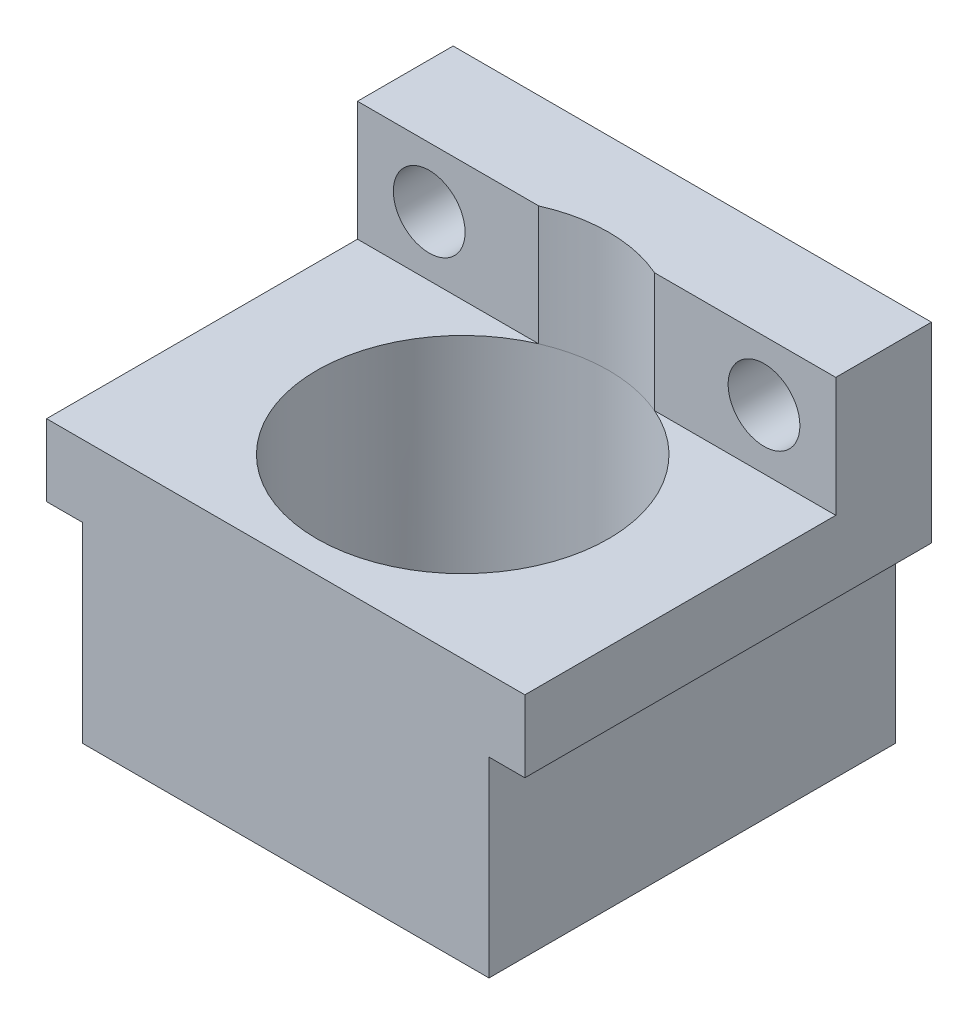
ISO-10303-21;
HEADER;
FILE_DESCRIPTION(('STEP AP214'),'2;1');
FILE_NAME('part.step','',(''),(''),'','','');
FILE_SCHEMA(('AUTOMOTIVE_DESIGN { 1 0 10303 214 1 1 1 1 }'));
ENDSEC;
DATA;
#1=APPLICATION_CONTEXT('core data for automotive mechanical design processes');
#2=APPLICATION_PROTOCOL_DEFINITION('international standard','automotive_design',2000,#1);
#3=PRODUCT_CONTEXT('',#1,'mechanical');
#4=PRODUCT('Part','Part','',(#3));
#5=PRODUCT_RELATED_PRODUCT_CATEGORY('part','',(#4));
#6=PRODUCT_DEFINITION_FORMATION('','',#4);
#7=PRODUCT_DEFINITION_CONTEXT('part definition',#1,'design');
#8=PRODUCT_DEFINITION('design','',#6,#7);
#9=PRODUCT_DEFINITION_SHAPE('','',#8);
#10=(LENGTH_UNIT() NAMED_UNIT(*) SI_UNIT(.MILLI.,.METRE.));
#11=(NAMED_UNIT(*) PLANE_ANGLE_UNIT() SI_UNIT($,.RADIAN.));
#12=(NAMED_UNIT(*) SI_UNIT($,.STERADIAN.) SOLID_ANGLE_UNIT());
#13=UNCERTAINTY_MEASURE_WITH_UNIT(LENGTH_MEASURE(1.E-05),#10,'distance_accuracy_value','');
#14=(GEOMETRIC_REPRESENTATION_CONTEXT(3) GLOBAL_UNCERTAINTY_ASSIGNED_CONTEXT((#13)) GLOBAL_UNIT_ASSIGNED_CONTEXT((#10,
#11,#12)) REPRESENTATION_CONTEXT('',''));
#15=CARTESIAN_POINT('',(0.,0.,0.));
#16=DIRECTION('',(0.,0.,1.));
#17=DIRECTION('',(1.,0.,0.));
#18=AXIS2_PLACEMENT_3D('',#15,#16,#17);
#19=CARTESIAN_POINT('',(-36.9079919345788,27.1123089983022,1.));
#20=DIRECTION('',(0.,0.,-1.));
#21=DIRECTION('',(-1.,0.,0.));
#22=AXIS2_PLACEMENT_3D('',#19,#20,#21);
#23=PLANE('',#22);
#24=CARTESIAN_POINT('',(-22.4079919345789,23.6123089983022,1.));
#25=DIRECTION('',(0.,0.,1.));
#26=DIRECTION('',(1.,0.,0.));
#27=AXIS2_PLACEMENT_3D('',#24,#25,#26);
#28=CIRCLE('',#27,1.5);
#29=CARTESIAN_POINT('',(-20.9079919345789,23.6123089983022,1.));
#30=VERTEX_POINT('',#29);
#31=EDGE_CURVE('E179',#30,#30,#28,.T.);
#32=ORIENTED_EDGE('',*,*,#31,.F.);
#33=EDGE_LOOP('',(#32));
#34=FACE_BOUND('',#33,.T.);
#35=DIRECTION('',(1.,0.,0.));
#36=VECTOR('',#35,1.);
#37=CARTESIAN_POINT('',(-19.4079919345789,26.1123089983022,1.));
#38=LINE('',#37,#36);
#39=CARTESIAN_POINT('',(-26.9870498805222,26.1123089983022,1.00000000000001));
#40=VERTEX_POINT('',#39);
#41=CARTESIAN_POINT('',(-19.4079919345789,26.1123089983022,1.));
#42=VERTEX_POINT('',#41);
#43=EDGE_CURVE('E166',#40,#42,#38,.T.);
#44=ORIENTED_EDGE('',*,*,#43,.F.);
#45=DIRECTION('',(0.,-1.,0.));
#46=VECTOR('',#45,1.);
#47=CARTESIAN_POINT('',(-26.9870498805222,26.1123089983022,1.00000000000001));
#48=LINE('',#47,#46);
#49=CARTESIAN_POINT('',(-26.9870498805222,21.1168375017223,1.00000000000001));
#50=VERTEX_POINT('',#49);
#51=EDGE_CURVE('E311',#40,#50,#48,.T.);
#52=ORIENTED_EDGE('',*,*,#51,.T.);
#53=DIRECTION('',(-1.,0.,0.));
#54=VECTOR('',#53,1.);
#55=CARTESIAN_POINT('',(-39.4079919345789,21.1168375017223,1.));
#56=LINE('',#55,#54);
#57=CARTESIAN_POINT('',(-19.4079919345789,21.1168375017223,1.));
#58=VERTEX_POINT('',#57);
#59=EDGE_CURVE('E190',#58,#50,#56,.T.);
#60=ORIENTED_EDGE('',*,*,#59,.F.);
#61=DIRECTION('',(0.,-1.,0.));
#62=VECTOR('',#61,1.);
#63=CARTESIAN_POINT('',(-19.4079919345789,26.1123089983022,1.));
#64=LINE('',#63,#62);
#65=EDGE_CURVE('E155',#42,#58,#64,.T.);
#66=ORIENTED_EDGE('',*,*,#65,.F.);
#67=EDGE_LOOP('',(#44,#52,#60,#66));
#68=FACE_BOUND('',#67,.T.);
#69=ADVANCED_FACE('F32',(#34,#68),#23,.F.);
#70=CARTESIAN_POINT('',(-36.4079919345789,23.6123089983022,1.));
#71=DIRECTION('',(0.,0.,1.));
#72=DIRECTION('',(1.,0.,0.));
#73=AXIS2_PLACEMENT_3D('',#70,#71,#72);
#74=CIRCLE('',#73,1.5);
#75=CARTESIAN_POINT('',(-34.9079919345789,23.6123089983022,1.));
#76=VERTEX_POINT('',#75);
#77=EDGE_CURVE('E173',#76,#76,#74,.T.);
#78=ORIENTED_EDGE('',*,*,#77,.F.);
#79=EDGE_LOOP('',(#78));
#80=FACE_BOUND('',#79,.T.);
#81=CARTESIAN_POINT('',(-31.8289339886355,21.1168375017223,1.00000000000001));
#82=VERTEX_POINT('',#81);
#83=CARTESIAN_POINT('',(-39.4079919345789,21.1168375017223,1.));
#84=VERTEX_POINT('',#83);
#85=EDGE_CURVE('E193',#82,#84,#56,.T.);
#86=ORIENTED_EDGE('',*,*,#85,.F.);
#87=DIRECTION('',(0.,-1.,0.));
#88=VECTOR('',#87,1.);
#89=CARTESIAN_POINT('',(-31.8289339886355,26.1123089983022,1.00000000000001));
#90=LINE('',#89,#88);
#91=CARTESIAN_POINT('',(-31.8289339886355,26.1123089983022,1.00000000000001));
#92=VERTEX_POINT('',#91);
#93=EDGE_CURVE('E262',#92,#82,#90,.T.);
#94=ORIENTED_EDGE('',*,*,#93,.F.);
#95=CARTESIAN_POINT('',(-39.4079919345789,26.1123089983022,1.));
#96=VERTEX_POINT('',#95);
#97=EDGE_CURVE('E159',#96,#92,#38,.T.);
#98=ORIENTED_EDGE('',*,*,#97,.F.);
#99=DIRECTION('',(0.,-1.,0.));
#100=VECTOR('',#99,1.);
#101=CARTESIAN_POINT('',(-39.4079919345789,26.1123089983022,1.));
#102=LINE('',#101,#100);
#103=EDGE_CURVE('E151',#96,#84,#102,.T.);
#104=ORIENTED_EDGE('',*,*,#103,.T.);
#105=EDGE_LOOP('',(#86,#94,#98,#104));
#106=FACE_BOUND('',#105,.T.);
#107=ADVANCED_FACE('F247',(#80,#106),#23,.F.);
#108=CARTESIAN_POINT('',(-54.9079919345788,10.1123089983022,17.));
#109=DIRECTION('',(0.,1.,0.));
#110=DIRECTION('',(0.,0.,1.));
#111=AXIS2_PLACEMENT_3D('',#108,#109,#110);
#112=PLANE('',#111);
#113=CARTESIAN_POINT('',(-29.4079919345789,10.1123089983022,6.59902130473711));
#114=DIRECTION('',(0.,1.,0.));
#115=DIRECTION('',(0.,0.,1.));
#116=AXIS2_PLACEMENT_3D('',#113,#114,#115);
#117=CIRCLE('',#116,4.5);
#118=CARTESIAN_POINT('',(-29.4079919345789,10.1123089983022,11.0990213047371));
#119=VERTEX_POINT('',#118);
#120=EDGE_CURVE('E297',#119,#119,#117,.T.);
#121=ORIENTED_EDGE('',*,*,#120,.T.);
#122=EDGE_LOOP('',(#121));
#123=FACE_BOUND('',#122,.T.);
#124=DIRECTION('',(-1.,0.,0.));
#125=VECTOR('',#124,1.);
#126=CARTESIAN_POINT('',(-2.90799193457886,10.1123089983022,-3.));
#127=LINE('',#126,#125);
#128=CARTESIAN_POINT('',(-20.9079919345789,10.1123089983022,-3.));
#129=VERTEX_POINT('',#128);
#130=CARTESIAN_POINT('',(-37.9079919345789,10.1123089983022,-3.));
#131=VERTEX_POINT('',#130);
#132=EDGE_CURVE('E41',#129,#131,#127,.T.);
#133=ORIENTED_EDGE('',*,*,#132,.F.);
#134=DIRECTION('',(0.,0.,1.));
#135=VECTOR('',#134,1.);
#136=CARTESIAN_POINT('',(-20.9079919345789,10.1123089983022,-3.));
#137=LINE('',#136,#135);
#138=CARTESIAN_POINT('',(-20.9079919345789,10.1123089983022,14.));
#139=VERTEX_POINT('',#138);
#140=EDGE_CURVE('E345',#129,#139,#137,.T.);
#141=ORIENTED_EDGE('',*,*,#140,.T.);
#142=DIRECTION('',(1.,0.,0.));
#143=VECTOR('',#142,1.);
#144=CARTESIAN_POINT('',(-19.4079919345789,10.1123089983022,14.));
#145=LINE('',#144,#143);
#146=CARTESIAN_POINT('',(-37.9079919345789,10.1123089983022,14.));
#147=VERTEX_POINT('',#146);
#148=EDGE_CURVE('E274',#147,#139,#145,.T.);
#149=ORIENTED_EDGE('',*,*,#148,.F.);
#150=DIRECTION('',(0.,0.,1.));
#151=VECTOR('',#150,1.);
#152=CARTESIAN_POINT('',(-37.9079919345789,10.1123089983022,-3.));
#153=LINE('',#152,#151);
#154=EDGE_CURVE('E56',#131,#147,#153,.T.);
#155=ORIENTED_EDGE('',*,*,#154,.F.);
#156=EDGE_LOOP('',(#133,#141,#149,#155));
#157=FACE_BOUND('',#156,.T.);
#158=ADVANCED_FACE('F34',(#123,#157),#112,.F.);
#159=CARTESIAN_POINT('',(0.,0.,-3.));
#160=DIRECTION('',(0.,0.,-1.));
#161=DIRECTION('',(-1.,0.,0.));
#162=AXIS2_PLACEMENT_3D('',#159,#160,#161);
#163=PLANE('',#162);
#164=DIRECTION('',(0.,-1.,0.));
#165=VECTOR('',#164,1.);
#166=CARTESIAN_POINT('',(-20.9079919345789,10.1123089983022,-3.));
#167=LINE('',#166,#165);
#168=CARTESIAN_POINT('',(-20.9079919345789,18.1123089983022,-3.));
#169=VERTEX_POINT('',#168);
#170=EDGE_CURVE('E130',#169,#129,#167,.T.);
#171=ORIENTED_EDGE('',*,*,#170,.T.);
#172=ORIENTED_EDGE('',*,*,#132,.T.);
#173=DIRECTION('',(0.,1.,0.));
#174=VECTOR('',#173,1.);
#175=CARTESIAN_POINT('',(-37.9079919345789,10.1123089983022,-3.));
#176=LINE('',#175,#174);
#177=CARTESIAN_POINT('',(-37.9079919345789,18.1123089983022,-3.));
#178=VERTEX_POINT('',#177);
#179=EDGE_CURVE('E355',#131,#178,#176,.T.);
#180=ORIENTED_EDGE('',*,*,#179,.T.);
#181=DIRECTION('',(-1.,0.,0.));
#182=VECTOR('',#181,1.);
#183=CARTESIAN_POINT('',(-39.4079919345789,18.1123089983022,-3.));
#184=LINE('',#183,#182);
#185=CARTESIAN_POINT('',(-39.4079919345789,18.1123089983022,-3.));
#186=VERTEX_POINT('',#185);
#187=EDGE_CURVE('E305',#178,#186,#184,.T.);
#188=ORIENTED_EDGE('',*,*,#187,.T.);
#189=DIRECTION('',(0.,-1.,0.));
#190=VECTOR('',#189,1.);
#191=CARTESIAN_POINT('',(-39.4079919345789,26.1123089983022,-3.));
#192=LINE('',#191,#190);
#193=CARTESIAN_POINT('',(-39.4079919345789,26.1123089983022,-3.));
#194=VERTEX_POINT('',#193);
#195=EDGE_CURVE('E147',#194,#186,#192,.T.);
#196=ORIENTED_EDGE('',*,*,#195,.F.);
#197=DIRECTION('',(-1.,0.,0.));
#198=VECTOR('',#197,1.);
#199=CARTESIAN_POINT('',(-19.4079919345789,26.1123089983022,-3.));
#200=LINE('',#199,#198);
#201=CARTESIAN_POINT('',(-19.4079919345789,26.1123089983022,-3.));
#202=VERTEX_POINT('',#201);
#203=EDGE_CURVE('E145',#202,#194,#200,.T.);
#204=ORIENTED_EDGE('',*,*,#203,.F.);
#205=DIRECTION('',(0.,-1.,0.));
#206=VECTOR('',#205,1.);
#207=CARTESIAN_POINT('',(-19.4079919345789,26.1123089983022,-3.));
#208=LINE('',#207,#206);
#209=CARTESIAN_POINT('',(-19.4079919345789,18.1123089983022,-3.));
#210=VERTEX_POINT('',#209);
#211=EDGE_CURVE('E138',#202,#210,#208,.T.);
#212=ORIENTED_EDGE('',*,*,#211,.T.);
#213=DIRECTION('',(-1.,0.,0.));
#214=VECTOR('',#213,1.);
#215=CARTESIAN_POINT('',(-19.4079919345789,18.1123089983022,-3.));
#216=LINE('',#215,#214);
#217=EDGE_CURVE('E123',#210,#169,#216,.T.);
#218=ORIENTED_EDGE('',*,*,#217,.T.);
#219=EDGE_LOOP('',(#171,#172,#180,#188,#196,#204,#212,#218));
#220=FACE_BOUND('',#219,.T.);
#221=CARTESIAN_POINT('',(-22.4079919345789,23.6123089983022,-3.));
#222=DIRECTION('',(0.,0.,1.));
#223=DIRECTION('',(1.,0.,0.));
#224=AXIS2_PLACEMENT_3D('',#221,#222,#223);
#225=CIRCLE('',#224,1.5);
#226=CARTESIAN_POINT('',(-20.9079919345789,23.6123089983022,-3.));
#227=VERTEX_POINT('',#226);
#228=EDGE_CURVE('E176',#227,#227,#225,.T.);
#229=ORIENTED_EDGE('',*,*,#228,.T.);
#230=EDGE_LOOP('',(#229));
#231=FACE_BOUND('',#230,.T.);
#232=CARTESIAN_POINT('',(-36.4079919345789,23.6123089983022,-3.));
#233=DIRECTION('',(0.,0.,1.));
#234=DIRECTION('',(1.,0.,0.));
#235=AXIS2_PLACEMENT_3D('',#232,#233,#234);
#236=CIRCLE('',#235,1.5);
#237=CARTESIAN_POINT('',(-34.9079919345789,23.6123089983022,-3.));
#238=VERTEX_POINT('',#237);
#239=EDGE_CURVE('E172',#238,#238,#236,.T.);
#240=ORIENTED_EDGE('',*,*,#239,.T.);
#241=EDGE_LOOP('',(#240));
#242=FACE_BOUND('',#241,.T.);
#243=ADVANCED_FACE('F142',(#220,#231,#242),#163,.T.);
#244=CARTESIAN_POINT('',(-19.4079919345789,26.1123089983022,1.));
#245=DIRECTION('',(-1.,0.,0.));
#246=DIRECTION('',(0.,0.,1.));
#247=AXIS2_PLACEMENT_3D('',#244,#245,#246);
#248=PLANE('',#247);
#249=DIRECTION('',(0.,1.,0.));
#250=VECTOR('',#249,1.);
#251=CARTESIAN_POINT('',(-19.4079919345789,21.1168375017223,14.));
#252=LINE('',#251,#250);
#253=CARTESIAN_POINT('',(-19.4079919345789,18.1123089983022,14.));
#254=VERTEX_POINT('',#253);
#255=CARTESIAN_POINT('',(-19.4079919345789,21.1168375017223,14.));
#256=VERTEX_POINT('',#255);
#257=EDGE_CURVE('E140',#254,#256,#252,.T.);
#258=ORIENTED_EDGE('',*,*,#257,.F.);
#259=DIRECTION('',(0.,0.,1.));
#260=VECTOR('',#259,1.);
#261=CARTESIAN_POINT('',(-19.4079919345789,18.1123089983022,-3.));
#262=LINE('',#261,#260);
#263=EDGE_CURVE('E48',#210,#254,#262,.T.);
#264=ORIENTED_EDGE('',*,*,#263,.F.);
#265=ORIENTED_EDGE('',*,*,#211,.F.);
#266=DIRECTION('',(0.,0.,-1.));
#267=VECTOR('',#266,1.);
#268=CARTESIAN_POINT('',(-19.4079919345789,26.1123089983022,1.));
#269=LINE('',#268,#267);
#270=EDGE_CURVE('E170',#42,#202,#269,.T.);
#271=ORIENTED_EDGE('',*,*,#270,.F.);
#272=ORIENTED_EDGE('',*,*,#65,.T.);
#273=DIRECTION('',(0.,0.,-1.));
#274=VECTOR('',#273,1.);
#275=CARTESIAN_POINT('',(-19.4079919345789,21.1168375017223,14.));
#276=LINE('',#275,#274);
#277=EDGE_CURVE('E182',#256,#58,#276,.T.);
#278=ORIENTED_EDGE('',*,*,#277,.F.);
#279=EDGE_LOOP('',(#258,#264,#265,#271,#272,#278));
#280=FACE_BOUND('',#279,.T.);
#281=ADVANCED_FACE('F136',(#280),#248,.F.);
#282=CARTESIAN_POINT('',(-39.4079919345789,26.1123089983022,1.));
#283=DIRECTION('',(1.,0.,0.));
#284=DIRECTION('',(0.,0.,-1.));
#285=AXIS2_PLACEMENT_3D('',#282,#283,#284);
#286=PLANE('',#285);
#287=ORIENTED_EDGE('',*,*,#195,.T.);
#288=DIRECTION('',(0.,0.,1.));
#289=VECTOR('',#288,1.);
#290=CARTESIAN_POINT('',(-39.4079919345789,18.1123089983022,-3.));
#291=LINE('',#290,#289);
#292=CARTESIAN_POINT('',(-39.4079919345789,18.1123089983022,14.));
#293=VERTEX_POINT('',#292);
#294=EDGE_CURVE('E289',#186,#293,#291,.T.);
#295=ORIENTED_EDGE('',*,*,#294,.T.);
#296=DIRECTION('',(0.,-1.,0.));
#297=VECTOR('',#296,1.);
#298=CARTESIAN_POINT('',(-39.4079919345789,10.1123089983022,14.));
#299=LINE('',#298,#297);
#300=CARTESIAN_POINT('',(-39.4079919345789,21.1168375017223,14.));
#301=VERTEX_POINT('',#300);
#302=EDGE_CURVE('E187',#301,#293,#299,.T.);
#303=ORIENTED_EDGE('',*,*,#302,.F.);
#304=DIRECTION('',(0.,0.,-1.));
#305=VECTOR('',#304,1.);
#306=CARTESIAN_POINT('',(-39.4079919345789,21.1168375017223,14.));
#307=LINE('',#306,#305);
#308=EDGE_CURVE('E268',#301,#84,#307,.T.);
#309=ORIENTED_EDGE('',*,*,#308,.T.);
#310=ORIENTED_EDGE('',*,*,#103,.F.);
#311=DIRECTION('',(0.,0.,1.));
#312=VECTOR('',#311,1.);
#313=CARTESIAN_POINT('',(-39.4079919345789,26.1123089983022,1.));
#314=LINE('',#313,#312);
#315=EDGE_CURVE('E167',#194,#96,#314,.T.);
#316=ORIENTED_EDGE('',*,*,#315,.F.);
#317=EDGE_LOOP('',(#287,#295,#303,#309,#310,#316));
#318=FACE_BOUND('',#317,.T.);
#319=ADVANCED_FACE('F239',(#318),#286,.F.);
#320=CARTESIAN_POINT('',(0.,26.1123089983022,0.));
#321=DIRECTION('',(0.,1.,0.));
#322=DIRECTION('',(0.,0.,1.));
#323=AXIS2_PLACEMENT_3D('',#320,#321,#322);
#324=PLANE('',#323);
#325=CARTESIAN_POINT('',(-29.4079919345789,26.1123089983022,6.48990342090826));
#326=DIRECTION('',(0.,-1.,0.));
#327=DIRECTION('',(0.,0.,-1.));
#328=AXIS2_PLACEMENT_3D('',#325,#326,#327);
#329=CIRCLE('',#328,6.00000000000002);
#330=EDGE_CURVE('E307',#92,#40,#329,.T.);
#331=ORIENTED_EDGE('',*,*,#330,.T.);
#332=ORIENTED_EDGE('',*,*,#43,.T.);
#333=ORIENTED_EDGE('',*,*,#270,.T.);
#334=ORIENTED_EDGE('',*,*,#203,.T.);
#335=ORIENTED_EDGE('',*,*,#315,.T.);
#336=ORIENTED_EDGE('',*,*,#97,.T.);
#337=EDGE_LOOP('',(#331,#332,#333,#334,#335,#336));
#338=FACE_BOUND('',#337,.T.);
#339=ADVANCED_FACE('F235',(#338),#324,.T.);
#340=CARTESIAN_POINT('',(-36.4079919345789,23.6123089983022,-3.));
#341=DIRECTION('',(0.,0.,1.));
#342=DIRECTION('',(1.,0.,0.));
#343=AXIS2_PLACEMENT_3D('',#340,#341,#342);
#344=CYLINDRICAL_SURFACE('',#343,1.5);
#345=ORIENTED_EDGE('',*,*,#239,.F.);
#346=EDGE_LOOP('',(#345));
#347=FACE_BOUND('',#346,.T.);
#348=ORIENTED_EDGE('',*,*,#77,.T.);
#349=EDGE_LOOP('',(#348));
#350=FACE_BOUND('',#349,.T.);
#351=ADVANCED_FACE('F231',(#347,#350),#344,.F.);
#352=CARTESIAN_POINT('',(-22.4079919345789,23.6123089983022,-3.));
#353=DIRECTION('',(0.,0.,1.));
#354=DIRECTION('',(1.,0.,0.));
#355=AXIS2_PLACEMENT_3D('',#352,#353,#354);
#356=CYLINDRICAL_SURFACE('',#355,1.5);
#357=ORIENTED_EDGE('',*,*,#228,.F.);
#358=EDGE_LOOP('',(#357));
#359=FACE_BOUND('',#358,.T.);
#360=ORIENTED_EDGE('',*,*,#31,.T.);
#361=EDGE_LOOP('',(#360));
#362=FACE_BOUND('',#361,.T.);
#363=ADVANCED_FACE('F227',(#359,#362),#356,.F.);
#364=CARTESIAN_POINT('',(-39.4079919345789,21.1168375017223,14.));
#365=DIRECTION('',(0.,-1.,0.));
#366=DIRECTION('',(0.,0.,-1.));
#367=AXIS2_PLACEMENT_3D('',#364,#365,#366);
#368=PLANE('',#367);
#369=ORIENTED_EDGE('',*,*,#59,.T.);
#370=CARTESIAN_POINT('',(-29.4079919345789,21.1168375017223,6.59902130473711));
#371=DIRECTION('',(0.,-1.,0.));
#372=DIRECTION('',(0.,0.,-1.));
#373=AXIS2_PLACEMENT_3D('',#370,#371,#372);
#374=CIRCLE('',#373,6.1);
#375=EDGE_CURVE('E11',#50,#82,#374,.T.);
#376=ORIENTED_EDGE('',*,*,#375,.T.);
#377=ORIENTED_EDGE('',*,*,#85,.T.);
#378=ORIENTED_EDGE('',*,*,#308,.F.);
#379=DIRECTION('',(-1.,0.,0.));
#380=VECTOR('',#379,1.);
#381=CARTESIAN_POINT('',(-39.4079919345789,21.1168375017223,14.));
#382=LINE('',#381,#380);
#383=EDGE_CURVE('E279',#256,#301,#382,.T.);
#384=ORIENTED_EDGE('',*,*,#383,.F.);
#385=ORIENTED_EDGE('',*,*,#277,.T.);
#386=EDGE_LOOP('',(#369,#376,#377,#378,#384,#385));
#387=FACE_BOUND('',#386,.T.);
#388=ADVANCED_FACE('F223',(#387),#368,.F.);
#389=CARTESIAN_POINT('',(0.,0.,14.));
#390=DIRECTION('',(0.,0.,-1.));
#391=DIRECTION('',(-1.,0.,0.));
#392=AXIS2_PLACEMENT_3D('',#389,#390,#391);
#393=PLANE('',#392);
#394=ORIENTED_EDGE('',*,*,#148,.T.);
#395=DIRECTION('',(0.,-1.,0.));
#396=VECTOR('',#395,1.);
#397=CARTESIAN_POINT('',(-20.9079919345789,10.1123089983022,14.));
#398=LINE('',#397,#396);
#399=CARTESIAN_POINT('',(-20.9079919345789,18.1123089983022,14.));
#400=VERTEX_POINT('',#399);
#401=EDGE_CURVE('E131',#400,#139,#398,.T.);
#402=ORIENTED_EDGE('',*,*,#401,.F.);
#403=DIRECTION('',(-1.,0.,0.));
#404=VECTOR('',#403,1.);
#405=CARTESIAN_POINT('',(-19.4079919345789,18.1123089983022,14.));
#406=LINE('',#405,#404);
#407=EDGE_CURVE('E346',#254,#400,#406,.T.);
#408=ORIENTED_EDGE('',*,*,#407,.F.);
#409=ORIENTED_EDGE('',*,*,#257,.T.);
#410=ORIENTED_EDGE('',*,*,#383,.T.);
#411=ORIENTED_EDGE('',*,*,#302,.T.);
#412=DIRECTION('',(-1.,0.,0.));
#413=VECTOR('',#412,1.);
#414=CARTESIAN_POINT('',(-39.4079919345789,18.1123089983022,14.));
#415=LINE('',#414,#413);
#416=CARTESIAN_POINT('',(-37.9079919345789,18.1123089983022,14.));
#417=VERTEX_POINT('',#416);
#418=EDGE_CURVE('E301',#417,#293,#415,.T.);
#419=ORIENTED_EDGE('',*,*,#418,.F.);
#420=DIRECTION('',(0.,1.,0.));
#421=VECTOR('',#420,1.);
#422=CARTESIAN_POINT('',(-37.9079919345789,10.1123089983022,14.));
#423=LINE('',#422,#421);
#424=EDGE_CURVE('E350',#147,#417,#423,.T.);
#425=ORIENTED_EDGE('',*,*,#424,.F.);
#426=EDGE_LOOP('',(#394,#402,#408,#409,#410,#411,#419,#425));
#427=FACE_BOUND('',#426,.T.);
#428=ADVANCED_FACE('F218',(#427),#393,.F.);
#429=CARTESIAN_POINT('',(-29.4079919345789,11.1168375017223,6.59902130473711));
#430=DIRECTION('',(0.,1.,0.));
#431=DIRECTION('',(0.,0.,1.));
#432=AXIS2_PLACEMENT_3D('',#429,#430,#431);
#433=CYLINDRICAL_SURFACE('',#432,6.1);
#434=CARTESIAN_POINT('',(-29.4079919345789,11.1168375017223,6.59902130473711));
#435=DIRECTION('',(0.,1.,0.));
#436=DIRECTION('',(0.,0.,1.));
#437=AXIS2_PLACEMENT_3D('',#434,#435,#436);
#438=CIRCLE('',#437,6.1);
#439=CARTESIAN_POINT('',(-29.4079919345789,11.1168375017223,12.6990213047371));
#440=VERTEX_POINT('',#439);
#441=EDGE_CURVE('E196',#440,#440,#438,.T.);
#442=ORIENTED_EDGE('',*,*,#441,.F.);
#443=EDGE_LOOP('',(#442));
#444=FACE_BOUND('',#443,.T.);
#445=CARTESIAN_POINT('',(-29.4079919345789,21.1168375017223,6.59902130473711));
#446=DIRECTION('',(0.,1.,0.));
#447=DIRECTION('',(0.396875746566664,0.,-0.917872345038869));
#448=AXIS2_PLACEMENT_3D('',#445,#446,#447);
#449=CIRCLE('',#448,6.1);
#450=EDGE_CURVE('E203',#50,#82,#449,.T.);
#451=ORIENTED_EDGE('',*,*,#450,.T.);
#452=ORIENTED_EDGE('',*,*,#375,.F.);
#453=EDGE_LOOP('',(#451,#452));
#454=FACE_BOUND('',#453,.T.);
#455=ADVANCED_FACE('F207',(#444,#454),#433,.F.);
#456=CARTESIAN_POINT('',(-29.4079919345789,11.1168375017223,6.59902130473711));
#457=DIRECTION('',(0.,1.,0.));
#458=DIRECTION('',(0.,0.,1.));
#459=AXIS2_PLACEMENT_3D('',#456,#457,#458);
#460=PLANE('',#459);
#461=CARTESIAN_POINT('',(-29.4079919345789,11.1168375017223,6.59902130473711));
#462=DIRECTION('',(0.,1.,0.));
#463=DIRECTION('',(0.,0.,1.));
#464=AXIS2_PLACEMENT_3D('',#461,#462,#463);
#465=CIRCLE('',#464,4.5);
#466=CARTESIAN_POINT('',(-29.4079919345789,11.1168375017223,11.0990213047371));
#467=VERTEX_POINT('',#466);
#468=EDGE_CURVE('E293',#467,#467,#465,.T.);
#469=ORIENTED_EDGE('',*,*,#468,.F.);
#470=EDGE_LOOP('',(#469));
#471=FACE_BOUND('',#470,.T.);
#472=ORIENTED_EDGE('',*,*,#441,.T.);
#473=EDGE_LOOP('',(#472));
#474=FACE_BOUND('',#473,.T.);
#475=ADVANCED_FACE('F217',(#471,#474),#460,.T.);
#476=CARTESIAN_POINT('',(-29.4079919345789,26.1123089983022,6.48990342090826));
#477=DIRECTION('',(0.,-1.,0.));
#478=DIRECTION('',(0.,0.,-1.));
#479=AXIS2_PLACEMENT_3D('',#476,#477,#478);
#480=CYLINDRICAL_SURFACE('',#479,6.00000000000002);
#481=ORIENTED_EDGE('',*,*,#450,.F.);
#482=ORIENTED_EDGE('',*,*,#51,.F.);
#483=ORIENTED_EDGE('',*,*,#330,.F.);
#484=ORIENTED_EDGE('',*,*,#93,.T.);
#485=EDGE_LOOP('',(#481,#482,#483,#484));
#486=FACE_BOUND('',#485,.T.);
#487=ADVANCED_FACE('F318',(#486),#480,.F.);
#488=CARTESIAN_POINT('',(-29.4079919345789,10.1123089983022,6.59902130473711));
#489=DIRECTION('',(0.,1.,0.));
#490=DIRECTION('',(0.,0.,1.));
#491=AXIS2_PLACEMENT_3D('',#488,#489,#490);
#492=CYLINDRICAL_SURFACE('',#491,4.5);
#493=ORIENTED_EDGE('',*,*,#120,.F.);
#494=EDGE_LOOP('',(#493));
#495=FACE_BOUND('',#494,.T.);
#496=ORIENTED_EDGE('',*,*,#468,.T.);
#497=EDGE_LOOP('',(#496));
#498=FACE_BOUND('',#497,.T.);
#499=ADVANCED_FACE('F327',(#495,#498),#492,.F.);
#500=CARTESIAN_POINT('',(-39.4079919345789,18.1123089983022,-3.));
#501=DIRECTION('',(0.,1.,0.));
#502=DIRECTION('',(0.,0.,1.));
#503=AXIS2_PLACEMENT_3D('',#500,#501,#502);
#504=PLANE('',#503);
#505=ORIENTED_EDGE('',*,*,#418,.T.);
#506=ORIENTED_EDGE('',*,*,#294,.F.);
#507=ORIENTED_EDGE('',*,*,#187,.F.);
#508=DIRECTION('',(0.,0.,1.));
#509=VECTOR('',#508,1.);
#510=CARTESIAN_POINT('',(-37.9079919345789,18.1123089983022,-3.));
#511=LINE('',#510,#509);
#512=EDGE_CURVE('E294',#178,#417,#511,.T.);
#513=ORIENTED_EDGE('',*,*,#512,.T.);
#514=EDGE_LOOP('',(#505,#506,#507,#513));
#515=FACE_BOUND('',#514,.T.);
#516=ADVANCED_FACE('F330',(#515),#504,.F.);
#517=CARTESIAN_POINT('',(-37.9079919345789,10.1123089983022,-3.));
#518=DIRECTION('',(1.,0.,0.));
#519=DIRECTION('',(0.,0.,-1.));
#520=AXIS2_PLACEMENT_3D('',#517,#518,#519);
#521=PLANE('',#520);
#522=ORIENTED_EDGE('',*,*,#424,.T.);
#523=ORIENTED_EDGE('',*,*,#512,.F.);
#524=ORIENTED_EDGE('',*,*,#179,.F.);
#525=ORIENTED_EDGE('',*,*,#154,.T.);
#526=EDGE_LOOP('',(#522,#523,#524,#525));
#527=FACE_BOUND('',#526,.T.);
#528=ADVANCED_FACE('F332',(#527),#521,.F.);
#529=CARTESIAN_POINT('',(-20.9079919345789,10.1123089983022,-3.));
#530=DIRECTION('',(-1.,0.,0.));
#531=DIRECTION('',(0.,0.,1.));
#532=AXIS2_PLACEMENT_3D('',#529,#530,#531);
#533=PLANE('',#532);
#534=ORIENTED_EDGE('',*,*,#401,.T.);
#535=ORIENTED_EDGE('',*,*,#140,.F.);
#536=ORIENTED_EDGE('',*,*,#170,.F.);
#537=DIRECTION('',(0.,0.,1.));
#538=VECTOR('',#537,1.);
#539=CARTESIAN_POINT('',(-20.9079919345789,18.1123089983022,-3.));
#540=LINE('',#539,#538);
#541=EDGE_CURVE('E125',#169,#400,#540,.T.);
#542=ORIENTED_EDGE('',*,*,#541,.T.);
#543=EDGE_LOOP('',(#534,#535,#536,#542));
#544=FACE_BOUND('',#543,.T.);
#545=ADVANCED_FACE('F335',(#544),#533,.F.);
#546=CARTESIAN_POINT('',(-19.4079919345789,18.1123089983022,-3.));
#547=DIRECTION('',(0.,1.,0.));
#548=DIRECTION('',(0.,0.,1.));
#549=AXIS2_PLACEMENT_3D('',#546,#547,#548);
#550=PLANE('',#549);
#551=ORIENTED_EDGE('',*,*,#407,.T.);
#552=ORIENTED_EDGE('',*,*,#541,.F.);
#553=ORIENTED_EDGE('',*,*,#217,.F.);
#554=ORIENTED_EDGE('',*,*,#263,.T.);
#555=EDGE_LOOP('',(#551,#552,#553,#554));
#556=FACE_BOUND('',#555,.T.);
#557=ADVANCED_FACE('F124',(#556),#550,.F.);
#558=CLOSED_SHELL('',(#69,#107,#158,#243,#281,#319,#339,#351,#363,#388,#428,#455,#475,#487,#499,
#516,#528,#545,#557));
#559=MANIFOLD_SOLID_BREP('B2',#558);
#560=ADVANCED_BREP_SHAPE_REPRESENTATION('',(#18,#559),#14);
#561=SHAPE_DEFINITION_REPRESENTATION(#9,#560);
ENDSEC;
END-ISO-10303-21;
